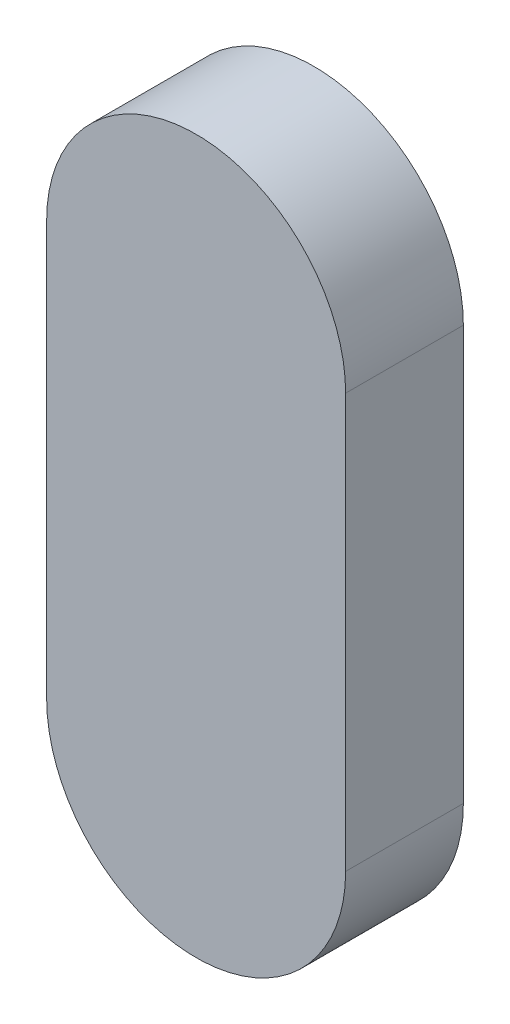
ISO-10303-21;
HEADER;
FILE_DESCRIPTION(('STEP AP214'),'2;1');
FILE_NAME('part.step','',(''),(''),'','','');
FILE_SCHEMA(('AUTOMOTIVE_DESIGN { 1 0 10303 214 1 1 1 1 }'));
ENDSEC;
DATA;
#1=APPLICATION_CONTEXT('core data for automotive mechanical design processes');
#2=APPLICATION_PROTOCOL_DEFINITION('international standard','automotive_design',2000,#1);
#3=PRODUCT_CONTEXT('',#1,'mechanical');
#4=PRODUCT('Part','Part','',(#3));
#5=PRODUCT_RELATED_PRODUCT_CATEGORY('part','',(#4));
#6=PRODUCT_DEFINITION_FORMATION('','',#4);
#7=PRODUCT_DEFINITION_CONTEXT('part definition',#1,'design');
#8=PRODUCT_DEFINITION('design','',#6,#7);
#9=PRODUCT_DEFINITION_SHAPE('','',#8);
#10=(LENGTH_UNIT() NAMED_UNIT(*) SI_UNIT(.MILLI.,.METRE.));
#11=(NAMED_UNIT(*) PLANE_ANGLE_UNIT() SI_UNIT($,.RADIAN.));
#12=(NAMED_UNIT(*) SI_UNIT($,.STERADIAN.) SOLID_ANGLE_UNIT());
#13=UNCERTAINTY_MEASURE_WITH_UNIT(LENGTH_MEASURE(1.E-05),#10,'distance_accuracy_value','');
#14=(GEOMETRIC_REPRESENTATION_CONTEXT(3) GLOBAL_UNCERTAINTY_ASSIGNED_CONTEXT((#13)) GLOBAL_UNIT_ASSIGNED_CONTEXT((#10,
#11,#12)) REPRESENTATION_CONTEXT('',''));
#15=CARTESIAN_POINT('',(0.,0.,0.));
#16=DIRECTION('',(0.,0.,1.));
#17=DIRECTION('',(1.,0.,0.));
#18=AXIS2_PLACEMENT_3D('',#15,#16,#17);
#19=CARTESIAN_POINT('',(150.5655104,86.3448108,0.));
#20=DIRECTION('',(-1.,0.,0.));
#21=DIRECTION('',(0.,1.,0.));
#22=AXIS2_PLACEMENT_3D('',#19,#20,#21);
#23=PLANE('',#22);
#24=DIRECTION('',(0.,1.,0.));
#25=VECTOR('',#24,1.);
#26=CARTESIAN_POINT('',(150.5655104,86.3448108,0.1999996));
#27=LINE('',#26,#25);
#28=CARTESIAN_POINT('',(150.5655104,86.3448108,0.1999996));
#29=VERTEX_POINT('',#28);
#30=CARTESIAN_POINT('',(150.5655104,87.0484924,0.1999996));
#31=VERTEX_POINT('',#30);
#32=EDGE_CURVE('E11',#29,#31,#27,.T.);
#33=ORIENTED_EDGE('',*,*,#32,.F.);
#34=DIRECTION('',(0.,0.,1.));
#35=VECTOR('',#34,1.);
#36=CARTESIAN_POINT('',(150.5655104,86.3448108,0.));
#37=LINE('',#36,#35);
#38=CARTESIAN_POINT('',(150.5655104,86.3448108,0.));
#39=VERTEX_POINT('',#38);
#40=EDGE_CURVE('E24',#39,#29,#37,.T.);
#41=ORIENTED_EDGE('',*,*,#40,.F.);
#42=DIRECTION('',(0.,1.,0.));
#43=VECTOR('',#42,1.);
#44=CARTESIAN_POINT('',(150.5655104,86.3448108,0.));
#45=LINE('',#44,#43);
#46=CARTESIAN_POINT('',(150.5655104,87.0484924,0.));
#47=VERTEX_POINT('',#46);
#48=EDGE_CURVE('E75',#39,#47,#45,.T.);
#49=ORIENTED_EDGE('',*,*,#48,.T.);
#50=DIRECTION('',(0.,0.,1.));
#51=VECTOR('',#50,1.);
#52=CARTESIAN_POINT('',(150.5655104,87.0484924,0.));
#53=LINE('',#52,#51);
#54=EDGE_CURVE('E37',#47,#31,#53,.T.);
#55=ORIENTED_EDGE('',*,*,#54,.T.);
#56=EDGE_LOOP('',(#33,#41,#49,#55));
#57=FACE_BOUND('',#56,.T.);
#58=ADVANCED_FACE('F17',(#57),#23,.F.);
#59=CARTESIAN_POINT('',(150.3115104,87.0484924,0.));
#60=DIRECTION('',(0.,0.,-1.));
#61=DIRECTION('',(1.,0.,0.));
#62=AXIS2_PLACEMENT_3D('',#59,#60,#61);
#63=CYLINDRICAL_SURFACE('',#62,0.253999999999991);
#64=CARTESIAN_POINT('',(150.3115104,87.0484924,0.1999996));
#65=DIRECTION('',(0.,0.,1.));
#66=DIRECTION('',(1.,0.,0.));
#67=AXIS2_PLACEMENT_3D('',#64,#65,#66);
#68=CIRCLE('',#67,0.253999999999991);
#69=CARTESIAN_POINT('',(150.0575104,87.0484924,0.1999996));
#70=VERTEX_POINT('',#69);
#71=EDGE_CURVE('E83',#31,#70,#68,.T.);
#72=ORIENTED_EDGE('',*,*,#71,.F.);
#73=ORIENTED_EDGE('',*,*,#54,.F.);
#74=CARTESIAN_POINT('',(150.3115104,87.0484924,0.));
#75=DIRECTION('',(0.,0.,1.));
#76=DIRECTION('',(1.,0.,0.));
#77=AXIS2_PLACEMENT_3D('',#74,#75,#76);
#78=CIRCLE('',#77,0.253999999999991);
#79=CARTESIAN_POINT('',(150.0575104,87.0484924,0.));
#80=VERTEX_POINT('',#79);
#81=EDGE_CURVE('E81',#47,#80,#78,.T.);
#82=ORIENTED_EDGE('',*,*,#81,.T.);
#83=DIRECTION('',(0.,0.,1.));
#84=VECTOR('',#83,1.);
#85=CARTESIAN_POINT('',(150.0575104,87.0484924,0.));
#86=LINE('',#85,#84);
#87=EDGE_CURVE('E67',#80,#70,#86,.T.);
#88=ORIENTED_EDGE('',*,*,#87,.T.);
#89=EDGE_LOOP('',(#72,#73,#82,#88));
#90=FACE_BOUND('',#89,.T.);
#91=ADVANCED_FACE('F89',(#90),#63,.T.);
#92=CARTESIAN_POINT('',(150.0575104,87.0484924,0.));
#93=DIRECTION('',(1.,0.,0.));
#94=DIRECTION('',(0.,-1.,0.));
#95=AXIS2_PLACEMENT_3D('',#92,#93,#94);
#96=PLANE('',#95);
#97=DIRECTION('',(0.,-1.,0.));
#98=VECTOR('',#97,1.);
#99=CARTESIAN_POINT('',(150.0575104,87.0484924,0.1999996));
#100=LINE('',#99,#98);
#101=CARTESIAN_POINT('',(150.0575104,86.3448108,0.1999996));
#102=VERTEX_POINT('',#101);
#103=EDGE_CURVE('E71',#70,#102,#100,.T.);
#104=ORIENTED_EDGE('',*,*,#103,.F.);
#105=ORIENTED_EDGE('',*,*,#87,.F.);
#106=DIRECTION('',(0.,-1.,0.));
#107=VECTOR('',#106,1.);
#108=CARTESIAN_POINT('',(150.0575104,87.0484924,0.));
#109=LINE('',#108,#107);
#110=CARTESIAN_POINT('',(150.0575104,86.3448108,0.));
#111=VERTEX_POINT('',#110);
#112=EDGE_CURVE('E63',#80,#111,#109,.T.);
#113=ORIENTED_EDGE('',*,*,#112,.T.);
#114=DIRECTION('',(0.,0.,1.));
#115=VECTOR('',#114,1.);
#116=CARTESIAN_POINT('',(150.0575104,86.3448108,0.));
#117=LINE('',#116,#115);
#118=EDGE_CURVE('E53',#111,#102,#117,.T.);
#119=ORIENTED_EDGE('',*,*,#118,.T.);
#120=EDGE_LOOP('',(#104,#105,#113,#119));
#121=FACE_BOUND('',#120,.T.);
#122=ADVANCED_FACE('F66',(#121),#96,.F.);
#123=CARTESIAN_POINT('',(150.3115104,86.3448108,0.));
#124=DIRECTION('',(0.,0.,-1.));
#125=DIRECTION('',(-1.,1.11896493820492E-13,0.));
#126=AXIS2_PLACEMENT_3D('',#123,#124,#125);
#127=CYLINDRICAL_SURFACE('',#126,0.253999999999986);
#128=CARTESIAN_POINT('',(150.3115104,86.3448108,0.1999996));
#129=DIRECTION('',(0.,0.,1.));
#130=DIRECTION('',(-1.,1.11896493820492E-13,0.));
#131=AXIS2_PLACEMENT_3D('',#128,#129,#130);
#132=CIRCLE('',#131,0.253999999999986);
#133=EDGE_CURVE('E59',#102,#29,#132,.T.);
#134=ORIENTED_EDGE('',*,*,#133,.F.);
#135=ORIENTED_EDGE('',*,*,#118,.F.);
#136=CARTESIAN_POINT('',(150.3115104,86.3448108,0.));
#137=DIRECTION('',(0.,0.,1.));
#138=DIRECTION('',(-1.,1.11896493820492E-13,0.));
#139=AXIS2_PLACEMENT_3D('',#136,#137,#138);
#140=CIRCLE('',#139,0.253999999999986);
#141=EDGE_CURVE('E57',#111,#39,#140,.T.);
#142=ORIENTED_EDGE('',*,*,#141,.T.);
#143=ORIENTED_EDGE('',*,*,#40,.T.);
#144=EDGE_LOOP('',(#134,#135,#142,#143));
#145=FACE_BOUND('',#144,.T.);
#146=ADVANCED_FACE('F55',(#145),#127,.T.);
#147=CARTESIAN_POINT('',(150.5655104,86.3448108,0.));
#148=DIRECTION('',(0.,0.,-1.));
#149=DIRECTION('',(-1.,0.,0.));
#150=AXIS2_PLACEMENT_3D('',#147,#148,#149);
#151=PLANE('',#150);
#152=ORIENTED_EDGE('',*,*,#141,.F.);
#153=ORIENTED_EDGE('',*,*,#112,.F.);
#154=ORIENTED_EDGE('',*,*,#81,.F.);
#155=ORIENTED_EDGE('',*,*,#48,.F.);
#156=EDGE_LOOP('',(#152,#153,#154,#155));
#157=FACE_BOUND('',#156,.T.);
#158=ADVANCED_FACE('F74',(#157),#151,.T.);
#159=CARTESIAN_POINT('',(150.5655104,86.3448108,0.1999996));
#160=DIRECTION('',(0.,0.,-1.));
#161=DIRECTION('',(-1.,0.,0.));
#162=AXIS2_PLACEMENT_3D('',#159,#160,#161);
#163=PLANE('',#162);
#164=ORIENTED_EDGE('',*,*,#32,.T.);
#165=ORIENTED_EDGE('',*,*,#71,.T.);
#166=ORIENTED_EDGE('',*,*,#103,.T.);
#167=ORIENTED_EDGE('',*,*,#133,.T.);
#168=EDGE_LOOP('',(#164,#165,#166,#167));
#169=FACE_BOUND('',#168,.T.);
#170=ADVANCED_FACE('F91',(#169),#163,.F.);
#171=CLOSED_SHELL('',(#58,#91,#122,#146,#158,#170));
#172=MANIFOLD_SOLID_BREP('B1',#171);
#173=ADVANCED_BREP_SHAPE_REPRESENTATION('',(#18,#172),#14);
#174=SHAPE_DEFINITION_REPRESENTATION(#9,#173);
ENDSEC;
END-ISO-10303-21;
